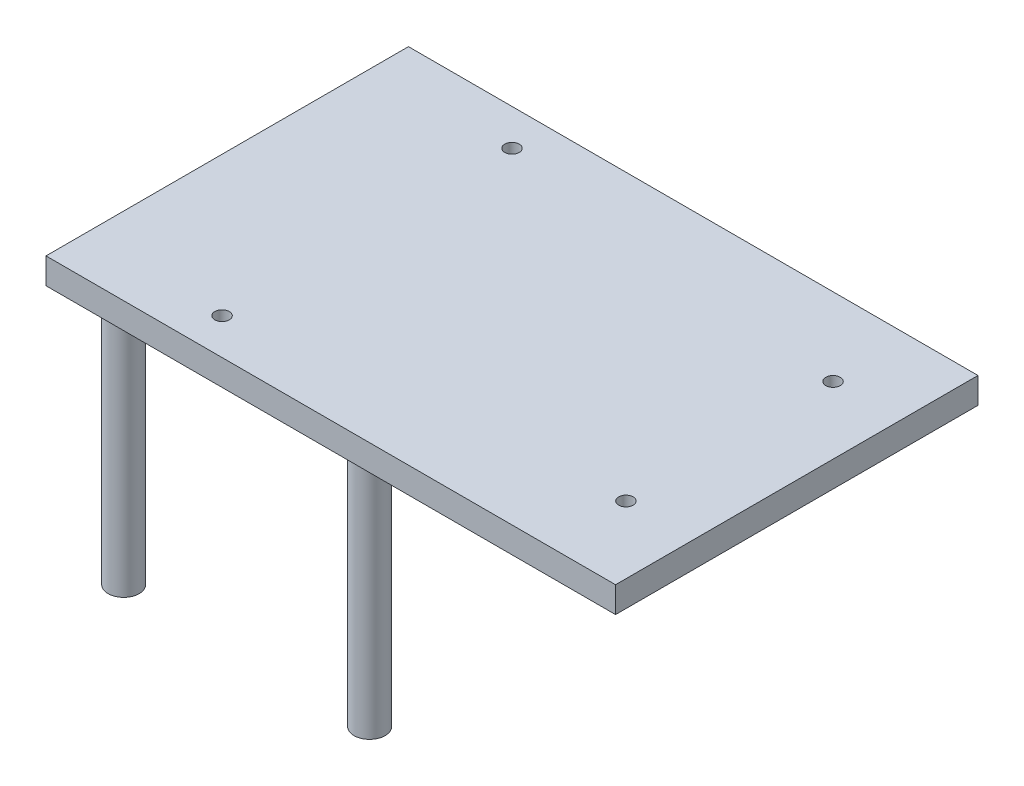
ISO-10303-21;
HEADER;
FILE_DESCRIPTION(('STEP AP214'),'2;1');
FILE_NAME('part.step','',(''),(''),'','','');
FILE_SCHEMA(('AUTOMOTIVE_DESIGN { 1 0 10303 214 1 1 1 1 }'));
ENDSEC;
DATA;
#1=APPLICATION_CONTEXT('core data for automotive mechanical design processes');
#2=APPLICATION_PROTOCOL_DEFINITION('international standard','automotive_design',2000,#1);
#3=PRODUCT_CONTEXT('',#1,'mechanical');
#4=PRODUCT('Part','Part','',(#3));
#5=PRODUCT_RELATED_PRODUCT_CATEGORY('part','',(#4));
#6=PRODUCT_DEFINITION_FORMATION('','',#4);
#7=PRODUCT_DEFINITION_CONTEXT('part definition',#1,'design');
#8=PRODUCT_DEFINITION('design','',#6,#7);
#9=PRODUCT_DEFINITION_SHAPE('','',#8);
#10=(LENGTH_UNIT() NAMED_UNIT(*) SI_UNIT(.MILLI.,.METRE.));
#11=(NAMED_UNIT(*) PLANE_ANGLE_UNIT() SI_UNIT($,.RADIAN.));
#12=(NAMED_UNIT(*) SI_UNIT($,.STERADIAN.) SOLID_ANGLE_UNIT());
#13=UNCERTAINTY_MEASURE_WITH_UNIT(LENGTH_MEASURE(1.E-05),#10,'distance_accuracy_value','');
#14=(GEOMETRIC_REPRESENTATION_CONTEXT(3) GLOBAL_UNCERTAINTY_ASSIGNED_CONTEXT((#13)) GLOBAL_UNIT_ASSIGNED_CONTEXT((#10,
#11,#12)) REPRESENTATION_CONTEXT('',''));
#15=CARTESIAN_POINT('',(0.,0.,0.));
#16=DIRECTION('',(0.,0.,1.));
#17=DIRECTION('',(1.,0.,0.));
#18=AXIS2_PLACEMENT_3D('',#15,#16,#17);
#19=CARTESIAN_POINT('',(55.,-5.,-35.));
#20=DIRECTION('',(1.,0.,0.));
#21=DIRECTION('',(0.,0.,-1.));
#22=AXIS2_PLACEMENT_3D('',#19,#20,#21);
#23=PLANE('',#22);
#24=DIRECTION('',(0.,0.,-1.));
#25=VECTOR('',#24,1.);
#26=CARTESIAN_POINT('',(55.,0.,-35.));
#27=LINE('',#26,#25);
#28=CARTESIAN_POINT('',(55.,0.,35.));
#29=VERTEX_POINT('',#28);
#30=CARTESIAN_POINT('',(55.,0.,-35.));
#31=VERTEX_POINT('',#30);
#32=EDGE_CURVE('E113',#29,#31,#27,.T.);
#33=ORIENTED_EDGE('',*,*,#32,.F.);
#34=DIRECTION('',(0.,1.,0.));
#35=VECTOR('',#34,1.);
#36=CARTESIAN_POINT('',(55.,-5.,35.));
#37=LINE('',#36,#35);
#38=CARTESIAN_POINT('',(55.,-5.,35.));
#39=VERTEX_POINT('',#38);
#40=EDGE_CURVE('E56',#39,#29,#37,.T.);
#41=ORIENTED_EDGE('',*,*,#40,.F.);
#42=DIRECTION('',(0.,0.,-1.));
#43=VECTOR('',#42,1.);
#44=CARTESIAN_POINT('',(55.,-5.,-35.));
#45=LINE('',#44,#43);
#46=CARTESIAN_POINT('',(55.,-5.,-35.));
#47=VERTEX_POINT('',#46);
#48=EDGE_CURVE('E104',#39,#47,#45,.T.);
#49=ORIENTED_EDGE('',*,*,#48,.T.);
#50=DIRECTION('',(0.,1.,0.));
#51=VECTOR('',#50,1.);
#52=CARTESIAN_POINT('',(55.,-5.,-35.));
#53=LINE('',#52,#51);
#54=EDGE_CURVE('E84',#47,#31,#53,.T.);
#55=ORIENTED_EDGE('',*,*,#54,.T.);
#56=EDGE_LOOP('',(#33,#41,#49,#55));
#57=FACE_BOUND('',#56,.T.);
#58=ADVANCED_FACE('F39',(#57),#23,.T.);
#59=CARTESIAN_POINT('',(-55.,-5.,35.));
#60=DIRECTION('',(0.,0.,1.));
#61=DIRECTION('',(1.,0.,0.));
#62=AXIS2_PLACEMENT_3D('',#59,#60,#61);
#63=PLANE('',#62);
#64=DIRECTION('',(1.,0.,0.));
#65=VECTOR('',#64,1.);
#66=CARTESIAN_POINT('',(-55.,0.,35.));
#67=LINE('',#66,#65);
#68=CARTESIAN_POINT('',(-55.,0.,35.));
#69=VERTEX_POINT('',#68);
#70=EDGE_CURVE('E107',#69,#29,#67,.T.);
#71=ORIENTED_EDGE('',*,*,#70,.F.);
#72=DIRECTION('',(0.,1.,0.));
#73=VECTOR('',#72,1.);
#74=CARTESIAN_POINT('',(-55.,-5.,35.));
#75=LINE('',#74,#73);
#76=CARTESIAN_POINT('',(-55.,-5.,35.));
#77=VERTEX_POINT('',#76);
#78=EDGE_CURVE('E73',#77,#69,#75,.T.);
#79=ORIENTED_EDGE('',*,*,#78,.F.);
#80=DIRECTION('',(1.,0.,0.));
#81=VECTOR('',#80,1.);
#82=CARTESIAN_POINT('',(-55.,-5.,35.));
#83=LINE('',#82,#81);
#84=EDGE_CURVE('E99',#77,#39,#83,.T.);
#85=ORIENTED_EDGE('',*,*,#84,.T.);
#86=ORIENTED_EDGE('',*,*,#40,.T.);
#87=EDGE_LOOP('',(#71,#79,#85,#86));
#88=FACE_BOUND('',#87,.T.);
#89=ADVANCED_FACE('F271',(#88),#63,.T.);
#90=CARTESIAN_POINT('',(-55.,-5.,-35.));
#91=DIRECTION('',(-1.,0.,0.));
#92=DIRECTION('',(0.,0.,1.));
#93=AXIS2_PLACEMENT_3D('',#90,#91,#92);
#94=PLANE('',#93);
#95=DIRECTION('',(0.,0.,1.));
#96=VECTOR('',#95,1.);
#97=CARTESIAN_POINT('',(-55.,0.,-35.));
#98=LINE('',#97,#96);
#99=CARTESIAN_POINT('',(-55.,0.,-35.));
#100=VERTEX_POINT('',#99);
#101=EDGE_CURVE('E92',#100,#69,#98,.T.);
#102=ORIENTED_EDGE('',*,*,#101,.F.);
#103=DIRECTION('',(0.,1.,0.));
#104=VECTOR('',#103,1.);
#105=CARTESIAN_POINT('',(-55.,-5.,-35.));
#106=LINE('',#105,#104);
#107=CARTESIAN_POINT('',(-55.,-5.,-35.));
#108=VERTEX_POINT('',#107);
#109=EDGE_CURVE('E87',#108,#100,#106,.T.);
#110=ORIENTED_EDGE('',*,*,#109,.F.);
#111=DIRECTION('',(0.,0.,1.));
#112=VECTOR('',#111,1.);
#113=CARTESIAN_POINT('',(-55.,-5.,-35.));
#114=LINE('',#113,#112);
#115=EDGE_CURVE('E90',#108,#77,#114,.T.);
#116=ORIENTED_EDGE('',*,*,#115,.T.);
#117=ORIENTED_EDGE('',*,*,#78,.T.);
#118=EDGE_LOOP('',(#102,#110,#116,#117));
#119=FACE_BOUND('',#118,.T.);
#120=ADVANCED_FACE('F89',(#119),#94,.T.);
#121=CARTESIAN_POINT('',(-55.,-5.,-35.));
#122=DIRECTION('',(0.,0.,-1.));
#123=DIRECTION('',(-1.,0.,0.));
#124=AXIS2_PLACEMENT_3D('',#121,#122,#123);
#125=PLANE('',#124);
#126=DIRECTION('',(-1.,0.,0.));
#127=VECTOR('',#126,1.);
#128=CARTESIAN_POINT('',(-55.,0.,-35.));
#129=LINE('',#128,#127);
#130=EDGE_CURVE('E117',#31,#100,#129,.T.);
#131=ORIENTED_EDGE('',*,*,#130,.F.);
#132=ORIENTED_EDGE('',*,*,#54,.F.);
#133=DIRECTION('',(-1.,0.,0.));
#134=VECTOR('',#133,1.);
#135=CARTESIAN_POINT('',(-55.,-5.,-35.));
#136=LINE('',#135,#134);
#137=EDGE_CURVE('E98',#47,#108,#136,.T.);
#138=ORIENTED_EDGE('',*,*,#137,.T.);
#139=ORIENTED_EDGE('',*,*,#109,.T.);
#140=EDGE_LOOP('',(#131,#132,#138,#139));
#141=FACE_BOUND('',#140,.T.);
#142=ADVANCED_FACE('F102',(#141),#125,.T.);
#143=CARTESIAN_POINT('',(0.,-5.,0.));
#144=DIRECTION('',(0.,1.,0.));
#145=DIRECTION('',(0.,0.,1.));
#146=AXIS2_PLACEMENT_3D('',#143,#144,#145);
#147=PLANE('',#146);
#148=CARTESIAN_POINT('',(-47.5,-5.,-27.5));
#149=DIRECTION('',(0.,1.,0.));
#150=DIRECTION('',(0.,0.,1.));
#151=AXIS2_PLACEMENT_3D('',#148,#149,#150);
#152=CIRCLE('',#151,3.);
#153=CARTESIAN_POINT('',(-47.5,-5.,-24.5));
#154=VERTEX_POINT('',#153);
#155=EDGE_CURVE('E11',#154,#154,#152,.F.);
#156=ORIENTED_EDGE('',*,*,#155,.F.);
#157=EDGE_LOOP('',(#156));
#158=FACE_BOUND('',#157,.T.);
#159=CARTESIAN_POINT('',(0.,-5.,-27.5));
#160=DIRECTION('',(0.,1.,0.));
#161=DIRECTION('',(0.,0.,1.));
#162=AXIS2_PLACEMENT_3D('',#159,#160,#161);
#163=CIRCLE('',#162,3.);
#164=CARTESIAN_POINT('',(0.,-5.,-24.5));
#165=VERTEX_POINT('',#164);
#166=EDGE_CURVE('E48',#165,#165,#163,.F.);
#167=ORIENTED_EDGE('',*,*,#166,.F.);
#168=EDGE_LOOP('',(#167));
#169=FACE_BOUND('',#168,.T.);
#170=CARTESIAN_POINT('',(0.,-5.,27.5));
#171=DIRECTION('',(0.,1.,0.));
#172=DIRECTION('',(0.,0.,1.));
#173=AXIS2_PLACEMENT_3D('',#170,#171,#172);
#174=CIRCLE('',#173,3.);
#175=CARTESIAN_POINT('',(0.,-5.,30.5));
#176=VERTEX_POINT('',#175);
#177=EDGE_CURVE('E136',#176,#176,#174,.F.);
#178=ORIENTED_EDGE('',*,*,#177,.F.);
#179=EDGE_LOOP('',(#178));
#180=FACE_BOUND('',#179,.T.);
#181=CARTESIAN_POINT('',(-47.5,-5.,27.5));
#182=DIRECTION('',(0.,1.,0.));
#183=DIRECTION('',(0.,0.,1.));
#184=AXIS2_PLACEMENT_3D('',#181,#182,#183);
#185=CIRCLE('',#184,3.);
#186=CARTESIAN_POINT('',(-47.5,-5.,30.5));
#187=VERTEX_POINT('',#186);
#188=EDGE_CURVE('E128',#187,#187,#185,.F.);
#189=ORIENTED_EDGE('',*,*,#188,.F.);
#190=EDGE_LOOP('',(#189));
#191=FACE_BOUND('',#190,.T.);
#192=CARTESIAN_POINT('',(-28.,-5.,-28.));
#193=DIRECTION('',(0.,1.,0.));
#194=DIRECTION('',(0.,0.,1.));
#195=AXIS2_PLACEMENT_3D('',#192,#193,#194);
#196=CIRCLE('',#195,1.4);
#197=CARTESIAN_POINT('',(-28.,-5.,-26.6));
#198=VERTEX_POINT('',#197);
#199=EDGE_CURVE('E118',#198,#198,#196,.T.);
#200=ORIENTED_EDGE('',*,*,#199,.T.);
#201=EDGE_LOOP('',(#200));
#202=FACE_BOUND('',#201,.T.);
#203=CARTESIAN_POINT('',(42.,-5.,20.));
#204=DIRECTION('',(0.,1.,0.));
#205=DIRECTION('',(0.,0.,1.));
#206=AXIS2_PLACEMENT_3D('',#203,#204,#205);
#207=CIRCLE('',#206,1.4);
#208=CARTESIAN_POINT('',(42.,-5.,21.4));
#209=VERTEX_POINT('',#208);
#210=EDGE_CURVE('E160',#209,#209,#207,.T.);
#211=ORIENTED_EDGE('',*,*,#210,.T.);
#212=EDGE_LOOP('',(#211));
#213=FACE_BOUND('',#212,.T.);
#214=CARTESIAN_POINT('',(-28.,-5.,28.));
#215=DIRECTION('',(0.,1.,0.));
#216=DIRECTION('',(0.,0.,1.));
#217=AXIS2_PLACEMENT_3D('',#214,#215,#216);
#218=CIRCLE('',#217,1.4);
#219=CARTESIAN_POINT('',(-28.,-5.,29.4));
#220=VERTEX_POINT('',#219);
#221=EDGE_CURVE('E164',#220,#220,#218,.T.);
#222=ORIENTED_EDGE('',*,*,#221,.T.);
#223=EDGE_LOOP('',(#222));
#224=FACE_BOUND('',#223,.T.);
#225=CARTESIAN_POINT('',(42.,-5.,-20.));
#226=DIRECTION('',(0.,1.,0.));
#227=DIRECTION('',(0.,0.,1.));
#228=AXIS2_PLACEMENT_3D('',#225,#226,#227);
#229=CIRCLE('',#228,1.4);
#230=CARTESIAN_POINT('',(42.,-5.,-18.6));
#231=VERTEX_POINT('',#230);
#232=EDGE_CURVE('E167',#231,#231,#229,.T.);
#233=ORIENTED_EDGE('',*,*,#232,.T.);
#234=EDGE_LOOP('',(#233));
#235=FACE_BOUND('',#234,.T.);
#236=ORIENTED_EDGE('',*,*,#48,.F.);
#237=ORIENTED_EDGE('',*,*,#84,.F.);
#238=ORIENTED_EDGE('',*,*,#115,.F.);
#239=ORIENTED_EDGE('',*,*,#137,.F.);
#240=EDGE_LOOP('',(#236,#237,#238,#239));
#241=FACE_BOUND('',#240,.T.);
#242=ADVANCED_FACE('F97',(#158,#169,#180,#191,#202,#213,#224,#235,#241),#147,.F.);
#243=CARTESIAN_POINT('',(0.,0.,0.));
#244=DIRECTION('',(0.,1.,0.));
#245=DIRECTION('',(0.,0.,1.));
#246=AXIS2_PLACEMENT_3D('',#243,#244,#245);
#247=PLANE('',#246);
#248=CARTESIAN_POINT('',(-28.,0.,-28.));
#249=DIRECTION('',(0.,1.,0.));
#250=DIRECTION('',(0.,0.,1.));
#251=AXIS2_PLACEMENT_3D('',#248,#249,#250);
#252=CIRCLE('',#251,1.4);
#253=CARTESIAN_POINT('',(-28.,0.,-26.6));
#254=VERTEX_POINT('',#253);
#255=EDGE_CURVE('E170',#254,#254,#252,.T.);
#256=ORIENTED_EDGE('',*,*,#255,.F.);
#257=EDGE_LOOP('',(#256));
#258=FACE_BOUND('',#257,.T.);
#259=CARTESIAN_POINT('',(42.,0.,20.));
#260=DIRECTION('',(0.,1.,0.));
#261=DIRECTION('',(0.,0.,1.));
#262=AXIS2_PLACEMENT_3D('',#259,#260,#261);
#263=CIRCLE('',#262,1.4);
#264=CARTESIAN_POINT('',(42.,0.,21.4));
#265=VERTEX_POINT('',#264);
#266=EDGE_CURVE('E180',#265,#265,#263,.T.);
#267=ORIENTED_EDGE('',*,*,#266,.F.);
#268=EDGE_LOOP('',(#267));
#269=FACE_BOUND('',#268,.T.);
#270=CARTESIAN_POINT('',(-28.,0.,28.));
#271=DIRECTION('',(0.,1.,0.));
#272=DIRECTION('',(0.,0.,1.));
#273=AXIS2_PLACEMENT_3D('',#270,#271,#272);
#274=CIRCLE('',#273,1.4);
#275=CARTESIAN_POINT('',(-28.,0.,29.4));
#276=VERTEX_POINT('',#275);
#277=EDGE_CURVE('E184',#276,#276,#274,.T.);
#278=ORIENTED_EDGE('',*,*,#277,.F.);
#279=EDGE_LOOP('',(#278));
#280=FACE_BOUND('',#279,.T.);
#281=CARTESIAN_POINT('',(42.,0.,-20.));
#282=DIRECTION('',(0.,1.,0.));
#283=DIRECTION('',(0.,0.,1.));
#284=AXIS2_PLACEMENT_3D('',#281,#282,#283);
#285=CIRCLE('',#284,1.4);
#286=CARTESIAN_POINT('',(42.,0.,-18.6));
#287=VERTEX_POINT('',#286);
#288=EDGE_CURVE('E171',#287,#287,#285,.T.);
#289=ORIENTED_EDGE('',*,*,#288,.F.);
#290=EDGE_LOOP('',(#289));
#291=FACE_BOUND('',#290,.T.);
#292=ORIENTED_EDGE('',*,*,#32,.T.);
#293=ORIENTED_EDGE('',*,*,#130,.T.);
#294=ORIENTED_EDGE('',*,*,#101,.T.);
#295=ORIENTED_EDGE('',*,*,#70,.T.);
#296=EDGE_LOOP('',(#292,#293,#294,#295));
#297=FACE_BOUND('',#296,.T.);
#298=ADVANCED_FACE('F147',(#258,#269,#280,#291,#297),#247,.T.);
#299=CARTESIAN_POINT('',(42.,-5.,-20.));
#300=DIRECTION('',(0.,1.,0.));
#301=DIRECTION('',(0.,0.,1.));
#302=AXIS2_PLACEMENT_3D('',#299,#300,#301);
#303=CYLINDRICAL_SURFACE('',#302,1.4);
#304=ORIENTED_EDGE('',*,*,#232,.F.);
#305=EDGE_LOOP('',(#304));
#306=FACE_BOUND('',#305,.T.);
#307=ORIENTED_EDGE('',*,*,#288,.T.);
#308=EDGE_LOOP('',(#307));
#309=FACE_BOUND('',#308,.T.);
#310=ADVANCED_FACE('F278',(#306,#309),#303,.F.);
#311=CARTESIAN_POINT('',(-28.,-5.,28.));
#312=DIRECTION('',(0.,1.,0.));
#313=DIRECTION('',(0.,0.,1.));
#314=AXIS2_PLACEMENT_3D('',#311,#312,#313);
#315=CYLINDRICAL_SURFACE('',#314,1.4);
#316=ORIENTED_EDGE('',*,*,#221,.F.);
#317=EDGE_LOOP('',(#316));
#318=FACE_BOUND('',#317,.T.);
#319=ORIENTED_EDGE('',*,*,#277,.T.);
#320=EDGE_LOOP('',(#319));
#321=FACE_BOUND('',#320,.T.);
#322=ADVANCED_FACE('F284',(#318,#321),#315,.F.);
#323=CARTESIAN_POINT('',(42.,-5.,20.));
#324=DIRECTION('',(0.,1.,0.));
#325=DIRECTION('',(0.,0.,1.));
#326=AXIS2_PLACEMENT_3D('',#323,#324,#325);
#327=CYLINDRICAL_SURFACE('',#326,1.4);
#328=ORIENTED_EDGE('',*,*,#210,.F.);
#329=EDGE_LOOP('',(#328));
#330=FACE_BOUND('',#329,.T.);
#331=ORIENTED_EDGE('',*,*,#266,.T.);
#332=EDGE_LOOP('',(#331));
#333=FACE_BOUND('',#332,.T.);
#334=ADVANCED_FACE('F468',(#330,#333),#327,.F.);
#335=CARTESIAN_POINT('',(-28.,-5.,-28.));
#336=DIRECTION('',(0.,1.,0.));
#337=DIRECTION('',(0.,0.,1.));
#338=AXIS2_PLACEMENT_3D('',#335,#336,#337);
#339=CYLINDRICAL_SURFACE('',#338,1.4);
#340=ORIENTED_EDGE('',*,*,#199,.F.);
#341=EDGE_LOOP('',(#340));
#342=FACE_BOUND('',#341,.T.);
#343=ORIENTED_EDGE('',*,*,#255,.T.);
#344=EDGE_LOOP('',(#343));
#345=FACE_BOUND('',#344,.T.);
#346=ADVANCED_FACE('F307',(#342,#345),#339,.F.);
#347=CARTESIAN_POINT('',(-47.5,-55.,27.5));
#348=DIRECTION('',(0.,1.,0.));
#349=DIRECTION('',(0.,0.,1.));
#350=AXIS2_PLACEMENT_3D('',#347,#348,#349);
#351=CYLINDRICAL_SURFACE('',#350,3.);
#352=CARTESIAN_POINT('',(-47.5,-55.,27.5));
#353=DIRECTION('',(0.,-1.,0.));
#354=DIRECTION('',(0.,0.,-1.));
#355=AXIS2_PLACEMENT_3D('',#352,#353,#354);
#356=CIRCLE('',#355,3.);
#357=CARTESIAN_POINT('',(-47.5,-55.,24.5));
#358=VERTEX_POINT('',#357);
#359=EDGE_CURVE('E192',#358,#358,#356,.T.);
#360=ORIENTED_EDGE('',*,*,#359,.F.);
#361=EDGE_LOOP('',(#360));
#362=FACE_BOUND('',#361,.T.);
#363=ORIENTED_EDGE('',*,*,#188,.T.);
#364=EDGE_LOOP('',(#363));
#365=FACE_BOUND('',#364,.T.);
#366=ADVANCED_FACE('F267',(#362,#365),#351,.T.);
#367=CARTESIAN_POINT('',(-47.5,-55.,27.5));
#368=DIRECTION('',(0.,-1.,0.));
#369=DIRECTION('',(0.,0.,-1.));
#370=AXIS2_PLACEMENT_3D('',#367,#368,#369);
#371=PLANE('',#370);
#372=CARTESIAN_POINT('',(-47.5,-55.,27.5));
#373=DIRECTION('',(0.,-1.,0.));
#374=DIRECTION('',(0.,0.,-1.));
#375=AXIS2_PLACEMENT_3D('',#372,#373,#374);
#376=CIRCLE('',#375,1.4);
#377=CARTESIAN_POINT('',(-47.5,-55.,26.1));
#378=VERTEX_POINT('',#377);
#379=EDGE_CURVE('E212',#378,#378,#376,.T.);
#380=ORIENTED_EDGE('',*,*,#379,.F.);
#381=EDGE_LOOP('',(#380));
#382=FACE_BOUND('',#381,.T.);
#383=ORIENTED_EDGE('',*,*,#359,.T.);
#384=EDGE_LOOP('',(#383));
#385=FACE_BOUND('',#384,.T.);
#386=ADVANCED_FACE('F262',(#382,#385),#371,.T.);
#387=CARTESIAN_POINT('',(0.,-55.,27.5));
#388=DIRECTION('',(0.,1.,0.));
#389=DIRECTION('',(0.,0.,1.));
#390=AXIS2_PLACEMENT_3D('',#387,#388,#389);
#391=CYLINDRICAL_SURFACE('',#390,3.);
#392=CARTESIAN_POINT('',(0.,-55.,27.5));
#393=DIRECTION('',(0.,-1.,0.));
#394=DIRECTION('',(0.,0.,-1.));
#395=AXIS2_PLACEMENT_3D('',#392,#393,#394);
#396=CIRCLE('',#395,3.);
#397=CARTESIAN_POINT('',(0.,-55.,24.5));
#398=VERTEX_POINT('',#397);
#399=EDGE_CURVE('E199',#398,#398,#396,.T.);
#400=ORIENTED_EDGE('',*,*,#399,.F.);
#401=EDGE_LOOP('',(#400));
#402=FACE_BOUND('',#401,.T.);
#403=ORIENTED_EDGE('',*,*,#177,.T.);
#404=EDGE_LOOP('',(#403));
#405=FACE_BOUND('',#404,.T.);
#406=ADVANCED_FACE('F256',(#402,#405),#391,.T.);
#407=CARTESIAN_POINT('',(0.,-55.,27.5));
#408=DIRECTION('',(0.,-1.,0.));
#409=DIRECTION('',(0.,0.,-1.));
#410=AXIS2_PLACEMENT_3D('',#407,#408,#409);
#411=PLANE('',#410);
#412=CARTESIAN_POINT('',(0.,-55.,27.5));
#413=DIRECTION('',(0.,-1.,0.));
#414=DIRECTION('',(0.,0.,-1.));
#415=AXIS2_PLACEMENT_3D('',#412,#413,#414);
#416=CIRCLE('',#415,1.4);
#417=CARTESIAN_POINT('',(0.,-55.,26.1));
#418=VERTEX_POINT('',#417);
#419=EDGE_CURVE('E236',#418,#418,#416,.T.);
#420=ORIENTED_EDGE('',*,*,#419,.F.);
#421=EDGE_LOOP('',(#420));
#422=FACE_BOUND('',#421,.T.);
#423=ORIENTED_EDGE('',*,*,#399,.T.);
#424=EDGE_LOOP('',(#423));
#425=FACE_BOUND('',#424,.T.);
#426=ADVANCED_FACE('F253',(#422,#425),#411,.T.);
#427=CARTESIAN_POINT('',(0.,-55.,-27.5));
#428=DIRECTION('',(0.,1.,0.));
#429=DIRECTION('',(0.,0.,1.));
#430=AXIS2_PLACEMENT_3D('',#427,#428,#429);
#431=CYLINDRICAL_SURFACE('',#430,3.);
#432=CARTESIAN_POINT('',(0.,-55.,-27.5));
#433=DIRECTION('',(0.,-1.,0.));
#434=DIRECTION('',(0.,0.,1.));
#435=AXIS2_PLACEMENT_3D('',#432,#433,#434);
#436=CIRCLE('',#435,3.);
#437=CARTESIAN_POINT('',(0.,-55.,-24.5));
#438=VERTEX_POINT('',#437);
#439=EDGE_CURVE('E203',#438,#438,#436,.T.);
#440=ORIENTED_EDGE('',*,*,#439,.F.);
#441=EDGE_LOOP('',(#440));
#442=FACE_BOUND('',#441,.T.);
#443=ORIENTED_EDGE('',*,*,#166,.T.);
#444=EDGE_LOOP('',(#443));
#445=FACE_BOUND('',#444,.T.);
#446=ADVANCED_FACE('F143',(#442,#445),#431,.T.);
#447=CARTESIAN_POINT('',(0.,-55.,-27.5));
#448=DIRECTION('',(0.,1.,0.));
#449=DIRECTION('',(0.,0.,1.));
#450=AXIS2_PLACEMENT_3D('',#447,#448,#449);
#451=PLANE('',#450);
#452=CARTESIAN_POINT('',(0.,-55.,-27.5));
#453=DIRECTION('',(0.,-1.,0.));
#454=DIRECTION('',(0.,0.,1.));
#455=AXIS2_PLACEMENT_3D('',#452,#453,#454);
#456=CIRCLE('',#455,1.4);
#457=CARTESIAN_POINT('',(0.,-55.,-26.1));
#458=VERTEX_POINT('',#457);
#459=EDGE_CURVE('E228',#458,#458,#456,.T.);
#460=ORIENTED_EDGE('',*,*,#459,.F.);
#461=EDGE_LOOP('',(#460));
#462=FACE_BOUND('',#461,.T.);
#463=ORIENTED_EDGE('',*,*,#439,.T.);
#464=EDGE_LOOP('',(#463));
#465=FACE_BOUND('',#464,.T.);
#466=ADVANCED_FACE('F331',(#462,#465),#451,.F.);
#467=CARTESIAN_POINT('',(-47.5,-55.,-27.5));
#468=DIRECTION('',(0.,1.,0.));
#469=DIRECTION('',(0.,0.,1.));
#470=AXIS2_PLACEMENT_3D('',#467,#468,#469);
#471=CYLINDRICAL_SURFACE('',#470,3.);
#472=CARTESIAN_POINT('',(-47.5,-55.,-27.5));
#473=DIRECTION('',(0.,-1.,0.));
#474=DIRECTION('',(0.,0.,1.));
#475=AXIS2_PLACEMENT_3D('',#472,#473,#474);
#476=CIRCLE('',#475,3.);
#477=CARTESIAN_POINT('',(-47.5,-55.,-24.5));
#478=VERTEX_POINT('',#477);
#479=EDGE_CURVE('E207',#478,#478,#476,.T.);
#480=ORIENTED_EDGE('',*,*,#479,.F.);
#481=EDGE_LOOP('',(#480));
#482=FACE_BOUND('',#481,.T.);
#483=ORIENTED_EDGE('',*,*,#155,.T.);
#484=EDGE_LOOP('',(#483));
#485=FACE_BOUND('',#484,.T.);
#486=ADVANCED_FACE('F339',(#482,#485),#471,.T.);
#487=CARTESIAN_POINT('',(-47.5,-55.,-27.5));
#488=DIRECTION('',(0.,1.,0.));
#489=DIRECTION('',(0.,0.,1.));
#490=AXIS2_PLACEMENT_3D('',#487,#488,#489);
#491=PLANE('',#490);
#492=CARTESIAN_POINT('',(-47.5,-55.,-27.5));
#493=DIRECTION('',(0.,-1.,0.));
#494=DIRECTION('',(0.,0.,1.));
#495=AXIS2_PLACEMENT_3D('',#492,#493,#494);
#496=CIRCLE('',#495,1.4);
#497=CARTESIAN_POINT('',(-47.5,-55.,-26.1));
#498=VERTEX_POINT('',#497);
#499=EDGE_CURVE('E220',#498,#498,#496,.T.);
#500=ORIENTED_EDGE('',*,*,#499,.F.);
#501=EDGE_LOOP('',(#500));
#502=FACE_BOUND('',#501,.T.);
#503=ORIENTED_EDGE('',*,*,#479,.T.);
#504=EDGE_LOOP('',(#503));
#505=FACE_BOUND('',#504,.T.);
#506=ADVANCED_FACE('F344',(#502,#505),#491,.F.);
#507=CARTESIAN_POINT('',(-47.5,-52.,-27.5));
#508=DIRECTION('',(0.,-1.,0.));
#509=DIRECTION('',(0.,0.,-1.));
#510=AXIS2_PLACEMENT_3D('',#507,#508,#509);
#511=CYLINDRICAL_SURFACE('',#510,1.4);
#512=CARTESIAN_POINT('',(-47.5,-52.,-27.5));
#513=DIRECTION('',(0.,-1.,0.));
#514=DIRECTION('',(0.,0.,1.));
#515=AXIS2_PLACEMENT_3D('',#512,#513,#514);
#516=CIRCLE('',#515,1.4);
#517=CARTESIAN_POINT('',(-47.5,-52.,-26.1));
#518=VERTEX_POINT('',#517);
#519=EDGE_CURVE('E224',#518,#518,#516,.T.);
#520=ORIENTED_EDGE('',*,*,#519,.F.);
#521=EDGE_LOOP('',(#520));
#522=FACE_BOUND('',#521,.T.);
#523=ORIENTED_EDGE('',*,*,#499,.T.);
#524=EDGE_LOOP('',(#523));
#525=FACE_BOUND('',#524,.T.);
#526=ADVANCED_FACE('F371',(#522,#525),#511,.F.);
#527=CARTESIAN_POINT('',(-47.5,-52.,-27.5));
#528=DIRECTION('',(0.,1.,0.));
#529=DIRECTION('',(0.,0.,1.));
#530=AXIS2_PLACEMENT_3D('',#527,#528,#529);
#531=PLANE('',#530);
#532=ORIENTED_EDGE('',*,*,#519,.T.);
#533=EDGE_LOOP('',(#532));
#534=FACE_BOUND('',#533,.T.);
#535=ADVANCED_FACE('F381',(#534),#531,.F.);
#536=CARTESIAN_POINT('',(0.,-52.,-27.5));
#537=DIRECTION('',(0.,-1.,0.));
#538=DIRECTION('',(0.,0.,-1.));
#539=AXIS2_PLACEMENT_3D('',#536,#537,#538);
#540=CYLINDRICAL_SURFACE('',#539,1.4);
#541=CARTESIAN_POINT('',(0.,-52.,-27.5));
#542=DIRECTION('',(0.,-1.,0.));
#543=DIRECTION('',(0.,0.,1.));
#544=AXIS2_PLACEMENT_3D('',#541,#542,#543);
#545=CIRCLE('',#544,1.4);
#546=CARTESIAN_POINT('',(0.,-52.,-26.1));
#547=VERTEX_POINT('',#546);
#548=EDGE_CURVE('E232',#547,#547,#545,.T.);
#549=ORIENTED_EDGE('',*,*,#548,.F.);
#550=EDGE_LOOP('',(#549));
#551=FACE_BOUND('',#550,.T.);
#552=ORIENTED_EDGE('',*,*,#459,.T.);
#553=EDGE_LOOP('',(#552));
#554=FACE_BOUND('',#553,.T.);
#555=ADVANCED_FACE('F391',(#551,#554),#540,.F.);
#556=CARTESIAN_POINT('',(0.,-52.,-27.5));
#557=DIRECTION('',(0.,1.,0.));
#558=DIRECTION('',(0.,0.,1.));
#559=AXIS2_PLACEMENT_3D('',#556,#557,#558);
#560=PLANE('',#559);
#561=ORIENTED_EDGE('',*,*,#548,.T.);
#562=EDGE_LOOP('',(#561));
#563=FACE_BOUND('',#562,.T.);
#564=ADVANCED_FACE('F249',(#563),#560,.F.);
#565=CARTESIAN_POINT('',(0.,-52.,27.5));
#566=DIRECTION('',(0.,-1.,0.));
#567=DIRECTION('',(0.,0.,-1.));
#568=AXIS2_PLACEMENT_3D('',#565,#566,#567);
#569=CYLINDRICAL_SURFACE('',#568,1.4);
#570=CARTESIAN_POINT('',(0.,-52.,27.5));
#571=DIRECTION('',(0.,-1.,0.));
#572=DIRECTION('',(0.,0.,-1.));
#573=AXIS2_PLACEMENT_3D('',#570,#571,#572);
#574=CIRCLE('',#573,1.4);
#575=CARTESIAN_POINT('',(0.,-52.,26.1));
#576=VERTEX_POINT('',#575);
#577=EDGE_CURVE('E216',#576,#576,#574,.T.);
#578=ORIENTED_EDGE('',*,*,#577,.F.);
#579=EDGE_LOOP('',(#578));
#580=FACE_BOUND('',#579,.T.);
#581=ORIENTED_EDGE('',*,*,#419,.T.);
#582=EDGE_LOOP('',(#581));
#583=FACE_BOUND('',#582,.T.);
#584=ADVANCED_FACE('F246',(#580,#583),#569,.F.);
#585=CARTESIAN_POINT('',(0.,-52.,27.5));
#586=DIRECTION('',(0.,-1.,0.));
#587=DIRECTION('',(0.,0.,-1.));
#588=AXIS2_PLACEMENT_3D('',#585,#586,#587);
#589=PLANE('',#588);
#590=ORIENTED_EDGE('',*,*,#577,.T.);
#591=EDGE_LOOP('',(#590));
#592=FACE_BOUND('',#591,.T.);
#593=ADVANCED_FACE('F244',(#592),#589,.T.);
#594=CARTESIAN_POINT('',(-47.5,-52.,27.5));
#595=DIRECTION('',(0.,-1.,0.));
#596=DIRECTION('',(0.,0.,-1.));
#597=AXIS2_PLACEMENT_3D('',#594,#595,#596);
#598=CYLINDRICAL_SURFACE('',#597,1.4);
#599=CARTESIAN_POINT('',(-47.5,-52.,27.5));
#600=DIRECTION('',(0.,-1.,0.));
#601=DIRECTION('',(0.,0.,-1.));
#602=AXIS2_PLACEMENT_3D('',#599,#600,#601);
#603=CIRCLE('',#602,1.4);
#604=CARTESIAN_POINT('',(-47.5,-52.,26.1));
#605=VERTEX_POINT('',#604);
#606=EDGE_CURVE('E211',#605,#605,#603,.T.);
#607=ORIENTED_EDGE('',*,*,#606,.F.);
#608=EDGE_LOOP('',(#607));
#609=FACE_BOUND('',#608,.T.);
#610=ORIENTED_EDGE('',*,*,#379,.T.);
#611=EDGE_LOOP('',(#610));
#612=FACE_BOUND('',#611,.T.);
#613=ADVANCED_FACE('F425',(#609,#612),#598,.F.);
#614=CARTESIAN_POINT('',(-47.5,-52.,27.5));
#615=DIRECTION('',(0.,-1.,0.));
#616=DIRECTION('',(0.,0.,-1.));
#617=AXIS2_PLACEMENT_3D('',#614,#615,#616);
#618=PLANE('',#617);
#619=ORIENTED_EDGE('',*,*,#606,.T.);
#620=EDGE_LOOP('',(#619));
#621=FACE_BOUND('',#620,.T.);
#622=ADVANCED_FACE('F434',(#621),#618,.T.);
#623=CLOSED_SHELL('',(#58,#89,#120,#142,#242,#298,#310,#322,#334,#346,#366,#386,#406,#426,#446,
#466,#486,#506,#526,#535,#555,#564,#584,#593,#613,#622));
#624=MANIFOLD_SOLID_BREP('B2',#623);
#625=ADVANCED_BREP_SHAPE_REPRESENTATION('',(#18,#624),#14);
#626=SHAPE_DEFINITION_REPRESENTATION(#9,#625);
ENDSEC;
END-ISO-10303-21;
